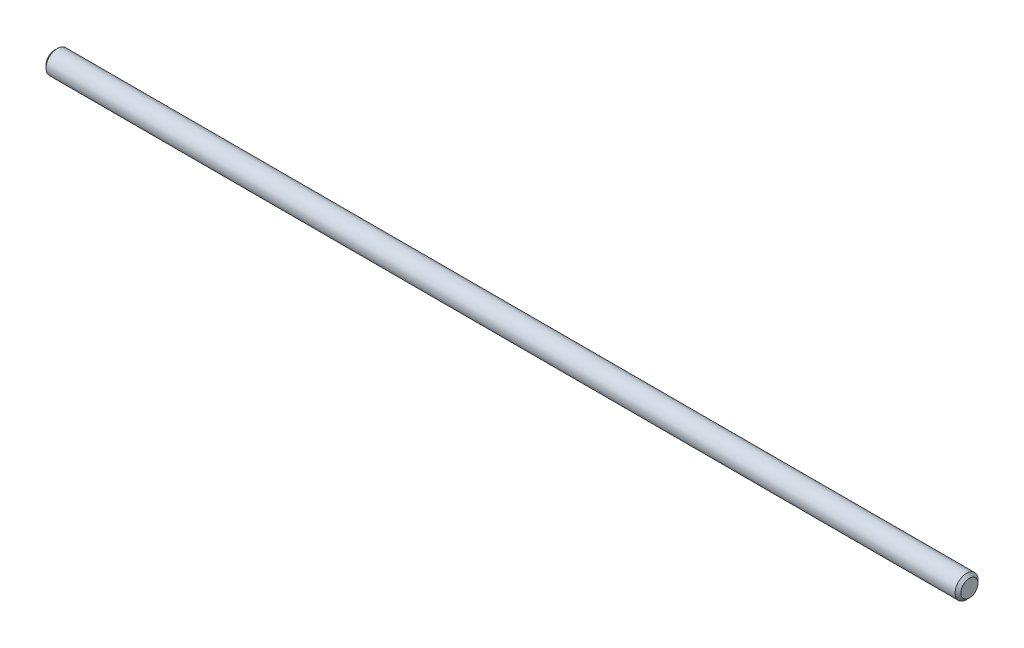
ISO-10303-21;
HEADER;
FILE_DESCRIPTION(('STEP AP214'),'2;1');
FILE_NAME('part.step','',(''),(''),'','','');
FILE_SCHEMA(('AUTOMOTIVE_DESIGN { 1 0 10303 214 1 1 1 1 }'));
ENDSEC;
DATA;
#1=APPLICATION_CONTEXT('core data for automotive mechanical design processes');
#2=APPLICATION_PROTOCOL_DEFINITION('international standard','automotive_design',2000,#1);
#3=PRODUCT_CONTEXT('',#1,'mechanical');
#4=PRODUCT('Part','Part','',(#3));
#5=PRODUCT_RELATED_PRODUCT_CATEGORY('part','',(#4));
#6=PRODUCT_DEFINITION_FORMATION('','',#4);
#7=PRODUCT_DEFINITION_CONTEXT('part definition',#1,'design');
#8=PRODUCT_DEFINITION('design','',#6,#7);
#9=PRODUCT_DEFINITION_SHAPE('','',#8);
#10=(LENGTH_UNIT() NAMED_UNIT(*) SI_UNIT(.MILLI.,.METRE.));
#11=(NAMED_UNIT(*) PLANE_ANGLE_UNIT() SI_UNIT($,.RADIAN.));
#12=(NAMED_UNIT(*) SI_UNIT($,.STERADIAN.) SOLID_ANGLE_UNIT());
#13=UNCERTAINTY_MEASURE_WITH_UNIT(LENGTH_MEASURE(1.E-05),#10,'distance_accuracy_value','');
#14=(GEOMETRIC_REPRESENTATION_CONTEXT(3) GLOBAL_UNCERTAINTY_ASSIGNED_CONTEXT((#13)) GLOBAL_UNIT_ASSIGNED_CONTEXT((#10,
#11,#12)) REPRESENTATION_CONTEXT('',''));
#15=CARTESIAN_POINT('',(0.,0.,0.));
#16=DIRECTION('',(0.,0.,1.));
#17=DIRECTION('',(1.,0.,0.));
#18=AXIS2_PLACEMENT_3D('',#15,#16,#17);
#19=CARTESIAN_POINT('',(80.,0.,0.));
#20=DIRECTION('',(-1.,0.,0.));
#21=DIRECTION('',(0.,0.,1.));
#22=AXIS2_PLACEMENT_3D('',#19,#20,#21);
#23=CYLINDRICAL_SURFACE('',#22,2.);
#24=CARTESIAN_POINT('',(79.5,0.,0.));
#25=DIRECTION('',(1.,0.,0.));
#26=DIRECTION('',(0.,0.,-1.));
#27=AXIS2_PLACEMENT_3D('',#24,#25,#26);
#28=CIRCLE('',#27,2.);
#29=CARTESIAN_POINT('',(79.5,0.,-2.));
#30=VERTEX_POINT('',#29);
#31=EDGE_CURVE('E41',#30,#30,#28,.F.);
#32=ORIENTED_EDGE('',*,*,#31,.T.);
#33=EDGE_LOOP('',(#32));
#34=FACE_BOUND('',#33,.T.);
#35=CARTESIAN_POINT('',(-79.5,0.,0.));
#36=DIRECTION('',(1.,0.,0.));
#37=DIRECTION('',(0.,0.,-1.));
#38=AXIS2_PLACEMENT_3D('',#35,#36,#37);
#39=CIRCLE('',#38,2.);
#40=CARTESIAN_POINT('',(-79.5,0.,-2.));
#41=VERTEX_POINT('',#40);
#42=EDGE_CURVE('E45',#41,#41,#39,.T.);
#43=ORIENTED_EDGE('',*,*,#42,.T.);
#44=EDGE_LOOP('',(#43));
#45=FACE_BOUND('',#44,.T.);
#46=ADVANCED_FACE('F34',(#34,#45),#23,.T.);
#47=CARTESIAN_POINT('',(80.,0.,0.));
#48=DIRECTION('',(1.,0.,0.));
#49=DIRECTION('',(0.,0.,-1.));
#50=AXIS2_PLACEMENT_3D('',#47,#48,#49);
#51=PLANE('',#50);
#52=CARTESIAN_POINT('',(80.,0.,0.));
#53=DIRECTION('',(1.,0.,0.));
#54=DIRECTION('',(0.,0.,-1.));
#55=AXIS2_PLACEMENT_3D('',#52,#53,#54);
#56=CIRCLE('',#55,1.5);
#57=CARTESIAN_POINT('',(80.,0.,-1.5));
#58=VERTEX_POINT('',#57);
#59=EDGE_CURVE('E49',#58,#58,#56,.T.);
#60=ORIENTED_EDGE('',*,*,#59,.T.);
#61=EDGE_LOOP('',(#60));
#62=FACE_BOUND('',#61,.T.);
#63=ADVANCED_FACE('F55',(#62),#51,.T.);
#64=CARTESIAN_POINT('',(-80.,0.,0.));
#65=DIRECTION('',(1.,0.,0.));
#66=DIRECTION('',(0.,0.,-1.));
#67=AXIS2_PLACEMENT_3D('',#64,#65,#66);
#68=PLANE('',#67);
#69=CARTESIAN_POINT('',(-80.,0.,0.));
#70=DIRECTION('',(1.,0.,0.));
#71=DIRECTION('',(0.,0.,-1.));
#72=AXIS2_PLACEMENT_3D('',#69,#70,#71);
#73=CIRCLE('',#72,1.49999999999996);
#74=CARTESIAN_POINT('',(-80.,0.,-1.49999999999996));
#75=VERTEX_POINT('',#74);
#76=EDGE_CURVE('E10',#75,#75,#73,.F.);
#77=ORIENTED_EDGE('',*,*,#76,.T.);
#78=EDGE_LOOP('',(#77));
#79=FACE_BOUND('',#78,.T.);
#80=ADVANCED_FACE('F59',(#79),#68,.F.);
#81=CARTESIAN_POINT('',(80.,0.,0.));
#82=DIRECTION('',(-1.,0.,0.));
#83=DIRECTION('',(0.,0.,1.));
#84=AXIS2_PLACEMENT_3D('',#81,#82,#83);
#85=CONICAL_SURFACE('',#84,1.5,0.785398163397433);
#86=ORIENTED_EDGE('',*,*,#31,.F.);
#87=EDGE_LOOP('',(#86));
#88=FACE_BOUND('',#87,.T.);
#89=ORIENTED_EDGE('',*,*,#59,.F.);
#90=EDGE_LOOP('',(#89));
#91=FACE_BOUND('',#90,.T.);
#92=ADVANCED_FACE('F57',(#88,#91),#85,.T.);
#93=CARTESIAN_POINT('',(-79.5,0.,0.));
#94=DIRECTION('',(1.,0.,0.));
#95=DIRECTION('',(0.,0.,-1.));
#96=AXIS2_PLACEMENT_3D('',#93,#94,#95);
#97=CONICAL_SURFACE('',#96,2.,0.78539816339746);
#98=ORIENTED_EDGE('',*,*,#76,.F.);
#99=EDGE_LOOP('',(#98));
#100=FACE_BOUND('',#99,.T.);
#101=ORIENTED_EDGE('',*,*,#42,.F.);
#102=EDGE_LOOP('',(#101));
#103=FACE_BOUND('',#102,.T.);
#104=ADVANCED_FACE('F36',(#100,#103),#97,.T.);
#105=CLOSED_SHELL('',(#46,#63,#80,#92,#104));
#106=MANIFOLD_SOLID_BREP('B2',#105);
#107=ADVANCED_BREP_SHAPE_REPRESENTATION('',(#18,#106),#14);
#108=SHAPE_DEFINITION_REPRESENTATION(#9,#107);
ENDSEC;
END-ISO-10303-21;
